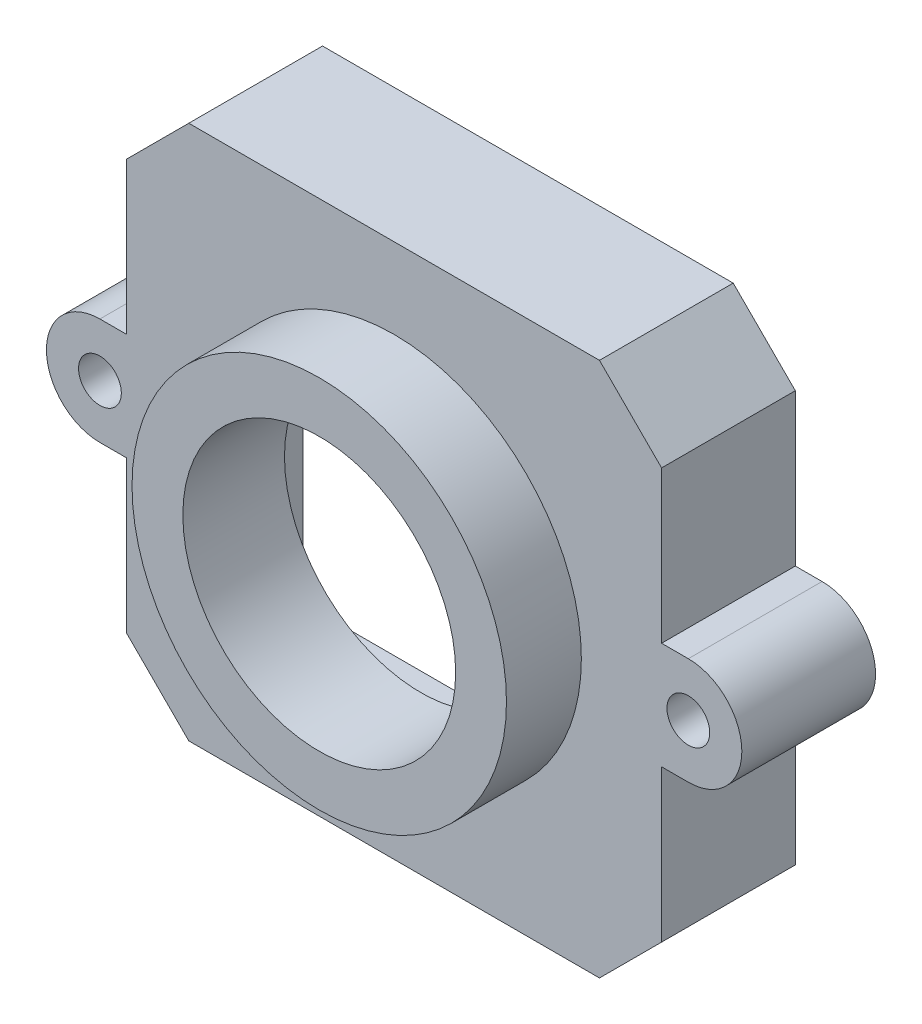
ISO-10303-21;
HEADER;
FILE_DESCRIPTION(('STEP AP214'),'2;1');
FILE_NAME('part.step','',(''),(''),'','','');
FILE_SCHEMA(('AUTOMOTIVE_DESIGN { 1 0 10303 214 1 1 1 1 }'));
ENDSEC;
DATA;
#1=APPLICATION_CONTEXT('core data for automotive mechanical design processes');
#2=APPLICATION_PROTOCOL_DEFINITION('international standard','automotive_design',2000,#1);
#3=PRODUCT_CONTEXT('',#1,'mechanical');
#4=PRODUCT('Part','Part','',(#3));
#5=PRODUCT_RELATED_PRODUCT_CATEGORY('part','',(#4));
#6=PRODUCT_DEFINITION_FORMATION('','',#4);
#7=PRODUCT_DEFINITION_CONTEXT('part definition',#1,'design');
#8=PRODUCT_DEFINITION('design','',#6,#7);
#9=PRODUCT_DEFINITION_SHAPE('','',#8);
#10=(LENGTH_UNIT() NAMED_UNIT(*) SI_UNIT(.MILLI.,.METRE.));
#11=(NAMED_UNIT(*) PLANE_ANGLE_UNIT() SI_UNIT($,.RADIAN.));
#12=(NAMED_UNIT(*) SI_UNIT($,.STERADIAN.) SOLID_ANGLE_UNIT());
#13=UNCERTAINTY_MEASURE_WITH_UNIT(LENGTH_MEASURE(1.E-05),#10,'distance_accuracy_value','');
#14=(GEOMETRIC_REPRESENTATION_CONTEXT(3) GLOBAL_UNCERTAINTY_ASSIGNED_CONTEXT((#13)) GLOBAL_UNIT_ASSIGNED_CONTEXT((#10,
#11,#12)) REPRESENTATION_CONTEXT('',''));
#15=CARTESIAN_POINT('',(0.,0.,0.));
#16=DIRECTION('',(0.,0.,1.));
#17=DIRECTION('',(1.,0.,0.));
#18=AXIS2_PLACEMENT_3D('',#15,#16,#17);
#19=CARTESIAN_POINT('',(0.,0.,1.));
#20=DIRECTION('',(0.,0.,1.));
#21=DIRECTION('',(1.,0.,0.));
#22=AXIS2_PLACEMENT_3D('',#19,#20,#21);
#23=PLANE('',#22);
#24=CARTESIAN_POINT('',(11.,0.,1.));
#25=DIRECTION('',(0.,0.,1.));
#26=DIRECTION('',(1.,0.,0.));
#27=AXIS2_PLACEMENT_3D('',#24,#25,#26);
#28=CIRCLE('',#27,0.800000000000001);
#29=CARTESIAN_POINT('',(11.8,0.,1.));
#30=VERTEX_POINT('',#29);
#31=EDGE_CURVE('E357',#30,#30,#28,.T.);
#32=ORIENTED_EDGE('',*,*,#31,.F.);
#33=EDGE_LOOP('',(#32));
#34=FACE_BOUND('',#33,.T.);
#35=CARTESIAN_POINT('',(-11.0000002241671,0.,1.));
#36=DIRECTION('',(0.,0.,1.));
#37=DIRECTION('',(1.,0.,0.));
#38=AXIS2_PLACEMENT_3D('',#35,#36,#37);
#39=CIRCLE('',#38,0.800000000000001);
#40=CARTESIAN_POINT('',(-10.2000002241671,0.,1.));
#41=VERTEX_POINT('',#40);
#42=EDGE_CURVE('E354',#41,#41,#39,.T.);
#43=ORIENTED_EDGE('',*,*,#42,.F.);
#44=EDGE_LOOP('',(#43));
#45=FACE_BOUND('',#44,.T.);
#46=DIRECTION('',(1.,0.,0.));
#47=VECTOR('',#46,1.);
#48=CARTESIAN_POINT('',(0.,-10.,1.));
#49=LINE('',#48,#47);
#50=CARTESIAN_POINT('',(-7.67766952966369,-10.,1.));
#51=VERTEX_POINT('',#50);
#52=CARTESIAN_POINT('',(7.67766952966369,-10.,1.));
#53=VERTEX_POINT('',#52);
#54=EDGE_CURVE('E299',#51,#53,#49,.T.);
#55=ORIENTED_EDGE('',*,*,#54,.T.);
#56=DIRECTION('',(0.707106781186548,0.707106781186548,0.));
#57=VECTOR('',#56,1.);
#58=CARTESIAN_POINT('',(8.83883476483185,-8.83883476483185,1.));
#59=LINE('',#58,#57);
#60=CARTESIAN_POINT('',(10.,-7.67766952966369,1.));
#61=VERTEX_POINT('',#60);
#62=EDGE_CURVE('E318',#53,#61,#59,.T.);
#63=ORIENTED_EDGE('',*,*,#62,.T.);
#64=DIRECTION('',(0.,-1.,0.));
#65=VECTOR('',#64,1.);
#66=CARTESIAN_POINT('',(10.,0.,1.));
#67=LINE('',#66,#65);
#68=CARTESIAN_POINT('',(10.,-2.,1.));
#69=VERTEX_POINT('',#68);
#70=EDGE_CURVE('E320',#69,#61,#67,.T.);
#71=ORIENTED_EDGE('',*,*,#70,.F.);
#72=DIRECTION('',(1.,0.,0.));
#73=VECTOR('',#72,1.);
#74=CARTESIAN_POINT('',(0.,-2.00000000000001,1.));
#75=LINE('',#74,#73);
#76=CARTESIAN_POINT('',(11.,-2.,1.));
#77=VERTEX_POINT('',#76);
#78=EDGE_CURVE('E323',#69,#77,#75,.T.);
#79=ORIENTED_EDGE('',*,*,#78,.T.);
#80=CARTESIAN_POINT('',(11.,0.,1.));
#81=DIRECTION('',(0.,0.,1.));
#82=DIRECTION('',(1.,0.,0.));
#83=AXIS2_PLACEMENT_3D('',#80,#81,#82);
#84=CIRCLE('',#83,2.);
#85=CARTESIAN_POINT('',(11.,2.,1.));
#86=VERTEX_POINT('',#85);
#87=EDGE_CURVE('E326',#86,#77,#84,.F.);
#88=ORIENTED_EDGE('',*,*,#87,.F.);
#89=DIRECTION('',(1.,0.,0.));
#90=VECTOR('',#89,1.);
#91=CARTESIAN_POINT('',(0.,1.99999999999999,1.));
#92=LINE('',#91,#90);
#93=CARTESIAN_POINT('',(10.,2.,1.));
#94=VERTEX_POINT('',#93);
#95=EDGE_CURVE('E329',#94,#86,#92,.T.);
#96=ORIENTED_EDGE('',*,*,#95,.F.);
#97=CARTESIAN_POINT('',(10.,7.67766952966368,1.));
#98=VERTEX_POINT('',#97);
#99=EDGE_CURVE('E324',#98,#94,#67,.T.);
#100=ORIENTED_EDGE('',*,*,#99,.F.);
#101=DIRECTION('',(0.707106781186548,-0.707106781186548,0.));
#102=VECTOR('',#101,1.);
#103=CARTESIAN_POINT('',(8.83883476483184,8.83883476483184,1.));
#104=LINE('',#103,#102);
#105=CARTESIAN_POINT('',(7.67766952966368,10.,1.));
#106=VERTEX_POINT('',#105);
#107=EDGE_CURVE('E332',#106,#98,#104,.T.);
#108=ORIENTED_EDGE('',*,*,#107,.F.);
#109=DIRECTION('',(1.,0.,0.));
#110=VECTOR('',#109,1.);
#111=CARTESIAN_POINT('',(0.,10.,1.));
#112=LINE('',#111,#110);
#113=CARTESIAN_POINT('',(-7.67766952966369,9.99999999999999,1.));
#114=VERTEX_POINT('',#113);
#115=EDGE_CURVE('E335',#114,#106,#112,.T.);
#116=ORIENTED_EDGE('',*,*,#115,.F.);
#117=DIRECTION('',(0.707106781186548,0.707106781186548,0.));
#118=VECTOR('',#117,1.);
#119=CARTESIAN_POINT('',(-8.83883476483184,8.83883476483184,1.));
#120=LINE('',#119,#118);
#121=CARTESIAN_POINT('',(-10.,7.67766952966369,1.));
#122=VERTEX_POINT('',#121);
#123=EDGE_CURVE('E338',#122,#114,#120,.T.);
#124=ORIENTED_EDGE('',*,*,#123,.F.);
#125=DIRECTION('',(0.,-1.,0.));
#126=VECTOR('',#125,1.);
#127=CARTESIAN_POINT('',(-10.,0.,1.));
#128=LINE('',#127,#126);
#129=CARTESIAN_POINT('',(-10.,2.,1.));
#130=VERTEX_POINT('',#129);
#131=EDGE_CURVE('E341',#122,#130,#128,.T.);
#132=ORIENTED_EDGE('',*,*,#131,.T.);
#133=DIRECTION('',(-1.,0.,0.));
#134=VECTOR('',#133,1.);
#135=CARTESIAN_POINT('',(0.,2.,1.));
#136=LINE('',#135,#134);
#137=CARTESIAN_POINT('',(-11.0000002241671,2.,1.));
#138=VERTEX_POINT('',#137);
#139=EDGE_CURVE('E343',#130,#138,#136,.T.);
#140=ORIENTED_EDGE('',*,*,#139,.T.);
#141=CARTESIAN_POINT('',(-11.0000002241671,0.,1.));
#142=DIRECTION('',(0.,0.,1.));
#143=DIRECTION('',(1.,0.,0.));
#144=AXIS2_PLACEMENT_3D('',#141,#142,#143);
#145=CIRCLE('',#144,2.);
#146=CARTESIAN_POINT('',(-11.0000002241671,-2.,1.));
#147=VERTEX_POINT('',#146);
#148=EDGE_CURVE('E346',#147,#138,#145,.F.);
#149=ORIENTED_EDGE('',*,*,#148,.F.);
#150=DIRECTION('',(-1.,0.,0.));
#151=VECTOR('',#150,1.);
#152=CARTESIAN_POINT('',(0.,-2.,1.));
#153=LINE('',#152,#151);
#154=CARTESIAN_POINT('',(-10.,-2.,1.));
#155=VERTEX_POINT('',#154);
#156=EDGE_CURVE('E349',#155,#147,#153,.T.);
#157=ORIENTED_EDGE('',*,*,#156,.F.);
#158=CARTESIAN_POINT('',(-10.,-7.67766952966369,1.));
#159=VERTEX_POINT('',#158);
#160=EDGE_CURVE('E344',#155,#159,#128,.T.);
#161=ORIENTED_EDGE('',*,*,#160,.T.);
#162=DIRECTION('',(0.707106781186547,-0.707106781186548,0.));
#163=VECTOR('',#162,1.);
#164=CARTESIAN_POINT('',(-8.83883476483185,-8.83883476483184,1.));
#165=LINE('',#164,#163);
#166=EDGE_CURVE('E352',#159,#51,#165,.T.);
#167=ORIENTED_EDGE('',*,*,#166,.T.);
#168=EDGE_LOOP('',(#55,#63,#71,#79,#88,#96,#100,#108,#116,#124,#132,#140,#149,#157,#161,#167));
#169=FACE_BOUND('',#168,.T.);
#170=CARTESIAN_POINT('',(0.,0.,1.));
#171=DIRECTION('',(0.,0.,1.));
#172=DIRECTION('',(1.,0.,0.));
#173=AXIS2_PLACEMENT_3D('',#170,#171,#172);
#174=CIRCLE('',#173,7.);
#175=CARTESIAN_POINT('',(7.,0.,1.));
#176=VERTEX_POINT('',#175);
#177=EDGE_CURVE('E219',#176,#176,#174,.T.);
#178=ORIENTED_EDGE('',*,*,#177,.F.);
#179=EDGE_LOOP('',(#178));
#180=FACE_BOUND('',#179,.T.);
#181=ADVANCED_FACE('F32',(#34,#45,#169,#180),#23,.T.);
#182=CARTESIAN_POINT('',(0.,-10.,1.));
#183=DIRECTION('',(0.,1.,0.));
#184=DIRECTION('',(0.,0.,1.));
#185=AXIS2_PLACEMENT_3D('',#182,#183,#184);
#186=PLANE('',#185);
#187=DIRECTION('',(0.,0.,-1.));
#188=VECTOR('',#187,1.);
#189=CARTESIAN_POINT('',(-7.67766952966369,-10.,1.));
#190=LINE('',#189,#188);
#191=CARTESIAN_POINT('',(-7.67766952966369,-10.,-4.));
#192=VERTEX_POINT('',#191);
#193=EDGE_CURVE('E360',#51,#192,#190,.T.);
#194=ORIENTED_EDGE('',*,*,#193,.T.);
#195=DIRECTION('',(1.,0.,0.));
#196=VECTOR('',#195,1.);
#197=CARTESIAN_POINT('',(0.,-10.,-4.));
#198=LINE('',#197,#196);
#199=CARTESIAN_POINT('',(7.67766952966369,-10.,-4.));
#200=VERTEX_POINT('',#199);
#201=EDGE_CURVE('E233',#192,#200,#198,.T.);
#202=ORIENTED_EDGE('',*,*,#201,.T.);
#203=DIRECTION('',(0.,0.,-1.));
#204=VECTOR('',#203,1.);
#205=CARTESIAN_POINT('',(7.67766952966369,-10.,1.));
#206=LINE('',#205,#204);
#207=EDGE_CURVE('E11',#53,#200,#206,.T.);
#208=ORIENTED_EDGE('',*,*,#207,.F.);
#209=ORIENTED_EDGE('',*,*,#54,.F.);
#210=EDGE_LOOP('',(#194,#202,#208,#209));
#211=FACE_BOUND('',#210,.T.);
#212=ADVANCED_FACE('F34',(#211),#186,.F.);
#213=CARTESIAN_POINT('',(8.83883476483185,-8.83883476483185,1.));
#214=DIRECTION('',(-0.707106781186547,0.707106781186547,0.));
#215=DIRECTION('',(-0.707106781186548,-0.707106781186548,0.));
#216=AXIS2_PLACEMENT_3D('',#213,#214,#215);
#217=PLANE('',#216);
#218=ORIENTED_EDGE('',*,*,#207,.T.);
#219=DIRECTION('',(0.707106781186548,0.707106781186548,0.));
#220=VECTOR('',#219,1.);
#221=CARTESIAN_POINT('',(8.83883476483185,-8.83883476483185,-4.));
#222=LINE('',#221,#220);
#223=CARTESIAN_POINT('',(10.,-7.67766952966369,-4.));
#224=VERTEX_POINT('',#223);
#225=EDGE_CURVE('E236',#200,#224,#222,.T.);
#226=ORIENTED_EDGE('',*,*,#225,.T.);
#227=DIRECTION('',(0.,0.,-1.));
#228=VECTOR('',#227,1.);
#229=CARTESIAN_POINT('',(10.,-7.67766952966369,1.));
#230=LINE('',#229,#228);
#231=EDGE_CURVE('E41',#61,#224,#230,.T.);
#232=ORIENTED_EDGE('',*,*,#231,.F.);
#233=ORIENTED_EDGE('',*,*,#62,.F.);
#234=EDGE_LOOP('',(#218,#226,#232,#233));
#235=FACE_BOUND('',#234,.T.);
#236=ADVANCED_FACE('F398',(#235),#217,.F.);
#237=CARTESIAN_POINT('',(10.,0.,1.));
#238=DIRECTION('',(1.,0.,0.));
#239=DIRECTION('',(0.,0.,-1.));
#240=AXIS2_PLACEMENT_3D('',#237,#238,#239);
#241=PLANE('',#240);
#242=ORIENTED_EDGE('',*,*,#231,.T.);
#243=DIRECTION('',(0.,-1.,0.));
#244=VECTOR('',#243,1.);
#245=CARTESIAN_POINT('',(10.,0.,-4.));
#246=LINE('',#245,#244);
#247=CARTESIAN_POINT('',(10.,-2.,-4.));
#248=VERTEX_POINT('',#247);
#249=EDGE_CURVE('E239',#248,#224,#246,.T.);
#250=ORIENTED_EDGE('',*,*,#249,.F.);
#251=DIRECTION('',(0.,0.,-1.));
#252=VECTOR('',#251,1.);
#253=CARTESIAN_POINT('',(10.,-2.,1.));
#254=LINE('',#253,#252);
#255=EDGE_CURVE('E386',#69,#248,#254,.T.);
#256=ORIENTED_EDGE('',*,*,#255,.F.);
#257=ORIENTED_EDGE('',*,*,#70,.T.);
#258=EDGE_LOOP('',(#242,#250,#256,#257));
#259=FACE_BOUND('',#258,.T.);
#260=ADVANCED_FACE('F391',(#259),#241,.T.);
#261=CARTESIAN_POINT('',(0.,-2.00000000000001,1.));
#262=DIRECTION('',(0.,1.,0.));
#263=DIRECTION('',(-1.,0.,0.));
#264=AXIS2_PLACEMENT_3D('',#261,#262,#263);
#265=PLANE('',#264);
#266=ORIENTED_EDGE('',*,*,#255,.T.);
#267=DIRECTION('',(1.,0.,0.));
#268=VECTOR('',#267,1.);
#269=CARTESIAN_POINT('',(0.,-2.00000000000001,-4.));
#270=LINE('',#269,#268);
#271=CARTESIAN_POINT('',(11.,-2.,-4.));
#272=VERTEX_POINT('',#271);
#273=EDGE_CURVE('E242',#248,#272,#270,.T.);
#274=ORIENTED_EDGE('',*,*,#273,.T.);
#275=DIRECTION('',(0.,0.,-1.));
#276=VECTOR('',#275,1.);
#277=CARTESIAN_POINT('',(11.,-2.,1.));
#278=LINE('',#277,#276);
#279=EDGE_CURVE('E384',#77,#272,#278,.T.);
#280=ORIENTED_EDGE('',*,*,#279,.F.);
#281=ORIENTED_EDGE('',*,*,#78,.F.);
#282=EDGE_LOOP('',(#266,#274,#280,#281));
#283=FACE_BOUND('',#282,.T.);
#284=ADVANCED_FACE('F460',(#283),#265,.F.);
#285=CARTESIAN_POINT('',(11.,0.,1.));
#286=DIRECTION('',(0.,0.,-1.));
#287=DIRECTION('',(-1.,0.,0.));
#288=AXIS2_PLACEMENT_3D('',#285,#286,#287);
#289=CYLINDRICAL_SURFACE('',#288,2.);
#290=ORIENTED_EDGE('',*,*,#279,.T.);
#291=CARTESIAN_POINT('',(11.,0.,-4.));
#292=DIRECTION('',(0.,0.,1.));
#293=DIRECTION('',(1.,0.,0.));
#294=AXIS2_PLACEMENT_3D('',#291,#292,#293);
#295=CIRCLE('',#294,2.);
#296=CARTESIAN_POINT('',(11.,2.,-4.));
#297=VERTEX_POINT('',#296);
#298=EDGE_CURVE('E246',#297,#272,#295,.F.);
#299=ORIENTED_EDGE('',*,*,#298,.F.);
#300=DIRECTION('',(0.,0.,-1.));
#301=VECTOR('',#300,1.);
#302=CARTESIAN_POINT('',(11.,2.,1.));
#303=LINE('',#302,#301);
#304=EDGE_CURVE('E382',#86,#297,#303,.T.);
#305=ORIENTED_EDGE('',*,*,#304,.F.);
#306=ORIENTED_EDGE('',*,*,#87,.T.);
#307=EDGE_LOOP('',(#290,#299,#305,#306));
#308=FACE_BOUND('',#307,.T.);
#309=ADVANCED_FACE('F456',(#308),#289,.T.);
#310=CARTESIAN_POINT('',(0.,1.99999999999999,1.));
#311=DIRECTION('',(0.,1.,0.));
#312=DIRECTION('',(-1.,0.,0.));
#313=AXIS2_PLACEMENT_3D('',#310,#311,#312);
#314=PLANE('',#313);
#315=ORIENTED_EDGE('',*,*,#304,.T.);
#316=DIRECTION('',(1.,0.,0.));
#317=VECTOR('',#316,1.);
#318=CARTESIAN_POINT('',(0.,1.99999999999999,-4.));
#319=LINE('',#318,#317);
#320=CARTESIAN_POINT('',(10.,2.,-4.));
#321=VERTEX_POINT('',#320);
#322=EDGE_CURVE('E249',#321,#297,#319,.T.);
#323=ORIENTED_EDGE('',*,*,#322,.F.);
#324=DIRECTION('',(0.,0.,-1.));
#325=VECTOR('',#324,1.);
#326=CARTESIAN_POINT('',(10.,2.,1.));
#327=LINE('',#326,#325);
#328=EDGE_CURVE('E380',#94,#321,#327,.T.);
#329=ORIENTED_EDGE('',*,*,#328,.F.);
#330=ORIENTED_EDGE('',*,*,#95,.T.);
#331=EDGE_LOOP('',(#315,#323,#329,#330));
#332=FACE_BOUND('',#331,.T.);
#333=ADVANCED_FACE('F452',(#332),#314,.T.);
#334=ORIENTED_EDGE('',*,*,#328,.T.);
#335=CARTESIAN_POINT('',(10.,7.67766952966368,-4.));
#336=VERTEX_POINT('',#335);
#337=EDGE_CURVE('E243',#336,#321,#246,.T.);
#338=ORIENTED_EDGE('',*,*,#337,.F.);
#339=DIRECTION('',(0.,0.,-1.));
#340=VECTOR('',#339,1.);
#341=CARTESIAN_POINT('',(10.,7.67766952966368,1.));
#342=LINE('',#341,#340);
#343=EDGE_CURVE('E378',#98,#336,#342,.T.);
#344=ORIENTED_EDGE('',*,*,#343,.F.);
#345=ORIENTED_EDGE('',*,*,#99,.T.);
#346=EDGE_LOOP('',(#334,#338,#344,#345));
#347=FACE_BOUND('',#346,.T.);
#348=ADVANCED_FACE('F448',(#347),#241,.T.);
#349=CARTESIAN_POINT('',(8.83883476483184,8.83883476483184,1.));
#350=DIRECTION('',(0.707106781186547,0.707106781186547,0.));
#351=DIRECTION('',(-0.707106781186548,0.707106781186548,0.));
#352=AXIS2_PLACEMENT_3D('',#349,#350,#351);
#353=PLANE('',#352);
#354=ORIENTED_EDGE('',*,*,#343,.T.);
#355=DIRECTION('',(0.707106781186548,-0.707106781186548,0.));
#356=VECTOR('',#355,1.);
#357=CARTESIAN_POINT('',(8.83883476483184,8.83883476483184,-4.));
#358=LINE('',#357,#356);
#359=CARTESIAN_POINT('',(7.67766952966368,10.,-4.));
#360=VERTEX_POINT('',#359);
#361=EDGE_CURVE('E252',#360,#336,#358,.T.);
#362=ORIENTED_EDGE('',*,*,#361,.F.);
#363=DIRECTION('',(0.,0.,-1.));
#364=VECTOR('',#363,1.);
#365=CARTESIAN_POINT('',(7.67766952966368,10.,1.));
#366=LINE('',#365,#364);
#367=EDGE_CURVE('E376',#106,#360,#366,.T.);
#368=ORIENTED_EDGE('',*,*,#367,.F.);
#369=ORIENTED_EDGE('',*,*,#107,.T.);
#370=EDGE_LOOP('',(#354,#362,#368,#369));
#371=FACE_BOUND('',#370,.T.);
#372=ADVANCED_FACE('F443',(#371),#353,.T.);
#373=CARTESIAN_POINT('',(0.,10.,1.));
#374=DIRECTION('',(0.,1.,0.));
#375=DIRECTION('',(0.,0.,1.));
#376=AXIS2_PLACEMENT_3D('',#373,#374,#375);
#377=PLANE('',#376);
#378=ORIENTED_EDGE('',*,*,#367,.T.);
#379=DIRECTION('',(1.,0.,0.));
#380=VECTOR('',#379,1.);
#381=CARTESIAN_POINT('',(0.,10.,-4.));
#382=LINE('',#381,#380);
#383=CARTESIAN_POINT('',(-7.67766952966369,9.99999999999999,-4.));
#384=VERTEX_POINT('',#383);
#385=EDGE_CURVE('E255',#384,#360,#382,.T.);
#386=ORIENTED_EDGE('',*,*,#385,.F.);
#387=DIRECTION('',(0.,0.,-1.));
#388=VECTOR('',#387,1.);
#389=CARTESIAN_POINT('',(-7.67766952966369,9.99999999999999,1.));
#390=LINE('',#389,#388);
#391=EDGE_CURVE('E374',#114,#384,#390,.T.);
#392=ORIENTED_EDGE('',*,*,#391,.F.);
#393=ORIENTED_EDGE('',*,*,#115,.T.);
#394=EDGE_LOOP('',(#378,#386,#392,#393));
#395=FACE_BOUND('',#394,.T.);
#396=ADVANCED_FACE('F439',(#395),#377,.T.);
#397=CARTESIAN_POINT('',(-8.83883476483184,8.83883476483184,1.));
#398=DIRECTION('',(-0.707106781186547,0.707106781186547,0.));
#399=DIRECTION('',(-0.707106781186548,-0.707106781186548,0.));
#400=AXIS2_PLACEMENT_3D('',#397,#398,#399);
#401=PLANE('',#400);
#402=ORIENTED_EDGE('',*,*,#391,.T.);
#403=DIRECTION('',(0.707106781186548,0.707106781186548,0.));
#404=VECTOR('',#403,1.);
#405=CARTESIAN_POINT('',(-8.83883476483184,8.83883476483184,-4.));
#406=LINE('',#405,#404);
#407=CARTESIAN_POINT('',(-10.,7.67766952966369,-4.));
#408=VERTEX_POINT('',#407);
#409=EDGE_CURVE('E258',#408,#384,#406,.T.);
#410=ORIENTED_EDGE('',*,*,#409,.F.);
#411=DIRECTION('',(0.,0.,-1.));
#412=VECTOR('',#411,1.);
#413=CARTESIAN_POINT('',(-10.,7.67766952966369,1.));
#414=LINE('',#413,#412);
#415=EDGE_CURVE('E372',#122,#408,#414,.T.);
#416=ORIENTED_EDGE('',*,*,#415,.F.);
#417=ORIENTED_EDGE('',*,*,#123,.T.);
#418=EDGE_LOOP('',(#402,#410,#416,#417));
#419=FACE_BOUND('',#418,.T.);
#420=ADVANCED_FACE('F434',(#419),#401,.T.);
#421=CARTESIAN_POINT('',(-10.,0.,1.));
#422=DIRECTION('',(1.,0.,0.));
#423=DIRECTION('',(0.,0.,-1.));
#424=AXIS2_PLACEMENT_3D('',#421,#422,#423);
#425=PLANE('',#424);
#426=ORIENTED_EDGE('',*,*,#415,.T.);
#427=DIRECTION('',(0.,-1.,0.));
#428=VECTOR('',#427,1.);
#429=CARTESIAN_POINT('',(-10.,0.,-4.));
#430=LINE('',#429,#428);
#431=CARTESIAN_POINT('',(-10.,2.,-4.));
#432=VERTEX_POINT('',#431);
#433=EDGE_CURVE('E261',#408,#432,#430,.T.);
#434=ORIENTED_EDGE('',*,*,#433,.T.);
#435=DIRECTION('',(0.,0.,-1.));
#436=VECTOR('',#435,1.);
#437=CARTESIAN_POINT('',(-10.,2.,1.));
#438=LINE('',#437,#436);
#439=EDGE_CURVE('E370',#130,#432,#438,.T.);
#440=ORIENTED_EDGE('',*,*,#439,.F.);
#441=ORIENTED_EDGE('',*,*,#131,.F.);
#442=EDGE_LOOP('',(#426,#434,#440,#441));
#443=FACE_BOUND('',#442,.T.);
#444=ADVANCED_FACE('F429',(#443),#425,.F.);
#445=CARTESIAN_POINT('',(0.,2.,1.));
#446=DIRECTION('',(0.,-1.,0.));
#447=DIRECTION('',(0.,0.,-1.));
#448=AXIS2_PLACEMENT_3D('',#445,#446,#447);
#449=PLANE('',#448);
#450=ORIENTED_EDGE('',*,*,#439,.T.);
#451=DIRECTION('',(-1.,0.,0.));
#452=VECTOR('',#451,1.);
#453=CARTESIAN_POINT('',(0.,2.,-4.));
#454=LINE('',#453,#452);
#455=CARTESIAN_POINT('',(-11.0000002241671,2.,-4.));
#456=VERTEX_POINT('',#455);
#457=EDGE_CURVE('E264',#432,#456,#454,.T.);
#458=ORIENTED_EDGE('',*,*,#457,.T.);
#459=DIRECTION('',(0.,0.,-1.));
#460=VECTOR('',#459,1.);
#461=CARTESIAN_POINT('',(-11.0000002241671,2.,1.));
#462=LINE('',#461,#460);
#463=EDGE_CURVE('E368',#138,#456,#462,.T.);
#464=ORIENTED_EDGE('',*,*,#463,.F.);
#465=ORIENTED_EDGE('',*,*,#139,.F.);
#466=EDGE_LOOP('',(#450,#458,#464,#465));
#467=FACE_BOUND('',#466,.T.);
#468=ADVANCED_FACE('F425',(#467),#449,.F.);
#469=CARTESIAN_POINT('',(-11.0000002241671,0.,1.));
#470=DIRECTION('',(0.,0.,-1.));
#471=DIRECTION('',(-1.,0.,0.));
#472=AXIS2_PLACEMENT_3D('',#469,#470,#471);
#473=CYLINDRICAL_SURFACE('',#472,2.);
#474=ORIENTED_EDGE('',*,*,#463,.T.);
#475=CARTESIAN_POINT('',(-11.0000002241671,0.,-4.));
#476=DIRECTION('',(0.,0.,1.));
#477=DIRECTION('',(1.,0.,0.));
#478=AXIS2_PLACEMENT_3D('',#475,#476,#477);
#479=CIRCLE('',#478,2.);
#480=CARTESIAN_POINT('',(-11.0000002241671,-2.,-4.));
#481=VERTEX_POINT('',#480);
#482=EDGE_CURVE('E268',#481,#456,#479,.F.);
#483=ORIENTED_EDGE('',*,*,#482,.F.);
#484=DIRECTION('',(0.,0.,-1.));
#485=VECTOR('',#484,1.);
#486=CARTESIAN_POINT('',(-11.0000002241671,-2.,1.));
#487=LINE('',#486,#485);
#488=EDGE_CURVE('E366',#147,#481,#487,.T.);
#489=ORIENTED_EDGE('',*,*,#488,.F.);
#490=ORIENTED_EDGE('',*,*,#148,.T.);
#491=EDGE_LOOP('',(#474,#483,#489,#490));
#492=FACE_BOUND('',#491,.T.);
#493=ADVANCED_FACE('F421',(#492),#473,.T.);
#494=CARTESIAN_POINT('',(0.,-2.,1.));
#495=DIRECTION('',(0.,-1.,0.));
#496=DIRECTION('',(0.,0.,-1.));
#497=AXIS2_PLACEMENT_3D('',#494,#495,#496);
#498=PLANE('',#497);
#499=ORIENTED_EDGE('',*,*,#488,.T.);
#500=DIRECTION('',(-1.,0.,0.));
#501=VECTOR('',#500,1.);
#502=CARTESIAN_POINT('',(0.,-2.,-4.));
#503=LINE('',#502,#501);
#504=CARTESIAN_POINT('',(-10.,-2.,-4.));
#505=VERTEX_POINT('',#504);
#506=EDGE_CURVE('E271',#505,#481,#503,.T.);
#507=ORIENTED_EDGE('',*,*,#506,.F.);
#508=DIRECTION('',(0.,0.,-1.));
#509=VECTOR('',#508,1.);
#510=CARTESIAN_POINT('',(-10.,-2.,1.));
#511=LINE('',#510,#509);
#512=EDGE_CURVE('E364',#155,#505,#511,.T.);
#513=ORIENTED_EDGE('',*,*,#512,.F.);
#514=ORIENTED_EDGE('',*,*,#156,.T.);
#515=EDGE_LOOP('',(#499,#507,#513,#514));
#516=FACE_BOUND('',#515,.T.);
#517=ADVANCED_FACE('F417',(#516),#498,.T.);
#518=ORIENTED_EDGE('',*,*,#512,.T.);
#519=CARTESIAN_POINT('',(-10.,-7.67766952966369,-4.));
#520=VERTEX_POINT('',#519);
#521=EDGE_CURVE('E265',#505,#520,#430,.T.);
#522=ORIENTED_EDGE('',*,*,#521,.T.);
#523=DIRECTION('',(0.,0.,-1.));
#524=VECTOR('',#523,1.);
#525=CARTESIAN_POINT('',(-10.,-7.67766952966369,1.));
#526=LINE('',#525,#524);
#527=EDGE_CURVE('E362',#159,#520,#526,.T.);
#528=ORIENTED_EDGE('',*,*,#527,.F.);
#529=ORIENTED_EDGE('',*,*,#160,.F.);
#530=EDGE_LOOP('',(#518,#522,#528,#529));
#531=FACE_BOUND('',#530,.T.);
#532=ADVANCED_FACE('F412',(#531),#425,.F.);
#533=CARTESIAN_POINT('',(-11.0000002241671,0.,1.));
#534=DIRECTION('',(0.,0.,-1.));
#535=DIRECTION('',(-1.,0.,0.));
#536=AXIS2_PLACEMENT_3D('',#533,#534,#535);
#537=CYLINDRICAL_SURFACE('',#536,0.800000000000001);
#538=ORIENTED_EDGE('',*,*,#42,.T.);
#539=EDGE_LOOP('',(#538));
#540=FACE_BOUND('',#539,.T.);
#541=CARTESIAN_POINT('',(-11.0000002241671,0.,-4.));
#542=DIRECTION('',(0.,0.,1.));
#543=DIRECTION('',(1.,0.,0.));
#544=AXIS2_PLACEMENT_3D('',#541,#542,#543);
#545=CIRCLE('',#544,0.800000000000001);
#546=CARTESIAN_POINT('',(-10.2000002241671,0.,-4.));
#547=VERTEX_POINT('',#546);
#548=EDGE_CURVE('E277',#547,#547,#545,.T.);
#549=ORIENTED_EDGE('',*,*,#548,.F.);
#550=EDGE_LOOP('',(#549));
#551=FACE_BOUND('',#550,.T.);
#552=ADVANCED_FACE('F530',(#540,#551),#537,.F.);
#553=CARTESIAN_POINT('',(-8.83883476483185,-8.83883476483184,1.));
#554=DIRECTION('',(0.707106781186548,0.707106781186547,0.));
#555=DIRECTION('',(-0.707106781186547,0.707106781186548,0.));
#556=AXIS2_PLACEMENT_3D('',#553,#554,#555);
#557=PLANE('',#556);
#558=ORIENTED_EDGE('',*,*,#527,.T.);
#559=DIRECTION('',(0.707106781186547,-0.707106781186548,0.));
#560=VECTOR('',#559,1.);
#561=CARTESIAN_POINT('',(-8.83883476483185,-8.83883476483184,-4.));
#562=LINE('',#561,#560);
#563=EDGE_CURVE('E274',#520,#192,#562,.T.);
#564=ORIENTED_EDGE('',*,*,#563,.T.);
#565=ORIENTED_EDGE('',*,*,#193,.F.);
#566=ORIENTED_EDGE('',*,*,#166,.F.);
#567=EDGE_LOOP('',(#558,#564,#565,#566));
#568=FACE_BOUND('',#567,.T.);
#569=ADVANCED_FACE('F406',(#568),#557,.F.);
#570=CARTESIAN_POINT('',(11.,0.,1.));
#571=DIRECTION('',(0.,0.,-1.));
#572=DIRECTION('',(-1.,0.,0.));
#573=AXIS2_PLACEMENT_3D('',#570,#571,#572);
#574=CYLINDRICAL_SURFACE('',#573,0.800000000000001);
#575=ORIENTED_EDGE('',*,*,#31,.T.);
#576=EDGE_LOOP('',(#575));
#577=FACE_BOUND('',#576,.T.);
#578=CARTESIAN_POINT('',(11.,0.,-4.));
#579=DIRECTION('',(0.,0.,1.));
#580=DIRECTION('',(1.,0.,0.));
#581=AXIS2_PLACEMENT_3D('',#578,#579,#580);
#582=CIRCLE('',#581,0.800000000000001);
#583=CARTESIAN_POINT('',(11.8,0.,-4.));
#584=VERTEX_POINT('',#583);
#585=EDGE_CURVE('E212',#584,#584,#582,.T.);
#586=ORIENTED_EDGE('',*,*,#585,.F.);
#587=EDGE_LOOP('',(#586));
#588=FACE_BOUND('',#587,.T.);
#589=ADVANCED_FACE('F522',(#577,#588),#574,.F.);
#590=CARTESIAN_POINT('',(-7.70746391493337,7.70746391493336,-4.));
#591=DIRECTION('',(-0.707106781186548,0.707106781186547,0.));
#592=DIRECTION('',(-0.707106781186547,-0.707106781186548,0.));
#593=AXIS2_PLACEMENT_3D('',#590,#591,#592);
#594=PLANE('',#593);
#595=DIRECTION('',(-0.707106781186547,-0.707106781186548,0.));
#596=VECTOR('',#595,1.);
#597=CARTESIAN_POINT('',(-7.70746391493337,7.70746391493336,0.));
#598=LINE('',#597,#596);
#599=CARTESIAN_POINT('',(-7.01492782986674,8.4,0.));
#600=VERTEX_POINT('',#599);
#601=CARTESIAN_POINT('',(-8.4,7.01492782986674,0.));
#602=VERTEX_POINT('',#601);
#603=EDGE_CURVE('E282',#600,#602,#598,.T.);
#604=ORIENTED_EDGE('',*,*,#603,.T.);
#605=DIRECTION('',(0.,0.,1.));
#606=VECTOR('',#605,1.);
#607=CARTESIAN_POINT('',(-8.4,7.01492782986674,-4.));
#608=LINE('',#607,#606);
#609=CARTESIAN_POINT('',(-8.4,7.01492782986674,-4.));
#610=VERTEX_POINT('',#609);
#611=EDGE_CURVE('E215',#610,#602,#608,.T.);
#612=ORIENTED_EDGE('',*,*,#611,.F.);
#613=DIRECTION('',(-0.707106781186547,-0.707106781186548,0.));
#614=VECTOR('',#613,1.);
#615=CARTESIAN_POINT('',(-7.70746391493337,7.70746391493336,-4.));
#616=LINE('',#615,#614);
#617=CARTESIAN_POINT('',(-7.01492782986674,8.4,-4.));
#618=VERTEX_POINT('',#617);
#619=EDGE_CURVE('E196',#618,#610,#616,.T.);
#620=ORIENTED_EDGE('',*,*,#619,.F.);
#621=DIRECTION('',(0.,0.,1.));
#622=VECTOR('',#621,1.);
#623=CARTESIAN_POINT('',(-7.01492782986674,8.4,-4.));
#624=LINE('',#623,#622);
#625=EDGE_CURVE('E206',#618,#600,#624,.T.);
#626=ORIENTED_EDGE('',*,*,#625,.T.);
#627=EDGE_LOOP('',(#604,#612,#620,#626));
#628=FACE_BOUND('',#627,.T.);
#629=ADVANCED_FACE('F214',(#628),#594,.F.);
#630=CARTESIAN_POINT('',(-8.4,0.,-4.));
#631=DIRECTION('',(-1.,0.,0.));
#632=DIRECTION('',(0.,-1.,0.));
#633=AXIS2_PLACEMENT_3D('',#630,#631,#632);
#634=PLANE('',#633);
#635=DIRECTION('',(0.,-1.,0.));
#636=VECTOR('',#635,1.);
#637=CARTESIAN_POINT('',(-8.4,0.,0.));
#638=LINE('',#637,#636);
#639=CARTESIAN_POINT('',(-8.4,-7.01492782986675,0.));
#640=VERTEX_POINT('',#639);
#641=EDGE_CURVE('E48',#602,#640,#638,.T.);
#642=ORIENTED_EDGE('',*,*,#641,.T.);
#643=DIRECTION('',(0.,0.,1.));
#644=VECTOR('',#643,1.);
#645=CARTESIAN_POINT('',(-8.4,-7.01492782986675,-4.));
#646=LINE('',#645,#644);
#647=CARTESIAN_POINT('',(-8.4,-7.01492782986675,-4.));
#648=VERTEX_POINT('',#647);
#649=EDGE_CURVE('E300',#648,#640,#646,.T.);
#650=ORIENTED_EDGE('',*,*,#649,.F.);
#651=DIRECTION('',(0.,-1.,0.));
#652=VECTOR('',#651,1.);
#653=CARTESIAN_POINT('',(-8.4,0.,-4.));
#654=LINE('',#653,#652);
#655=EDGE_CURVE('E231',#610,#648,#654,.T.);
#656=ORIENTED_EDGE('',*,*,#655,.F.);
#657=ORIENTED_EDGE('',*,*,#611,.T.);
#658=EDGE_LOOP('',(#642,#650,#656,#657));
#659=FACE_BOUND('',#658,.T.);
#660=ADVANCED_FACE('F495',(#659),#634,.F.);
#661=CARTESIAN_POINT('',(-7.70746391493337,-7.70746391493338,-4.));
#662=DIRECTION('',(-0.707106781186547,-0.707106781186548,0.));
#663=DIRECTION('',(0.707106781186548,-0.707106781186547,0.));
#664=AXIS2_PLACEMENT_3D('',#661,#662,#663);
#665=PLANE('',#664);
#666=DIRECTION('',(0.707106781186548,-0.707106781186547,0.));
#667=VECTOR('',#666,1.);
#668=CARTESIAN_POINT('',(-7.70746391493337,-7.70746391493338,0.));
#669=LINE('',#668,#667);
#670=CARTESIAN_POINT('',(-7.01492782986674,-8.4,0.));
#671=VERTEX_POINT('',#670);
#672=EDGE_CURVE('E53',#640,#671,#669,.T.);
#673=ORIENTED_EDGE('',*,*,#672,.T.);
#674=DIRECTION('',(0.,0.,1.));
#675=VECTOR('',#674,1.);
#676=CARTESIAN_POINT('',(-7.01492782986674,-8.4,-4.));
#677=LINE('',#676,#675);
#678=CARTESIAN_POINT('',(-7.01492782986674,-8.4,-4.));
#679=VERTEX_POINT('',#678);
#680=EDGE_CURVE('E303',#679,#671,#677,.T.);
#681=ORIENTED_EDGE('',*,*,#680,.F.);
#682=DIRECTION('',(0.707106781186548,-0.707106781186547,0.));
#683=VECTOR('',#682,1.);
#684=CARTESIAN_POINT('',(-7.70746391493337,-7.70746391493338,-4.));
#685=LINE('',#684,#683);
#686=EDGE_CURVE('E229',#648,#679,#685,.T.);
#687=ORIENTED_EDGE('',*,*,#686,.F.);
#688=ORIENTED_EDGE('',*,*,#649,.T.);
#689=EDGE_LOOP('',(#673,#681,#687,#688));
#690=FACE_BOUND('',#689,.T.);
#691=ADVANCED_FACE('F498',(#690),#665,.F.);
#692=CARTESIAN_POINT('',(0.,-8.4,-4.));
#693=DIRECTION('',(0.,-1.,0.));
#694=DIRECTION('',(0.,0.,-1.));
#695=AXIS2_PLACEMENT_3D('',#692,#693,#694);
#696=PLANE('',#695);
#697=DIRECTION('',(1.,0.,0.));
#698=VECTOR('',#697,1.);
#699=CARTESIAN_POINT('',(0.,-8.4,0.));
#700=LINE('',#699,#698);
#701=CARTESIAN_POINT('',(7.01492782986674,-8.4,0.));
#702=VERTEX_POINT('',#701);
#703=EDGE_CURVE('E294',#671,#702,#700,.T.);
#704=ORIENTED_EDGE('',*,*,#703,.T.);
#705=DIRECTION('',(0.,0.,1.));
#706=VECTOR('',#705,1.);
#707=CARTESIAN_POINT('',(7.01492782986674,-8.4,-4.));
#708=LINE('',#707,#706);
#709=CARTESIAN_POINT('',(7.01492782986674,-8.4,-4.));
#710=VERTEX_POINT('',#709);
#711=EDGE_CURVE('E306',#710,#702,#708,.T.);
#712=ORIENTED_EDGE('',*,*,#711,.F.);
#713=DIRECTION('',(1.,0.,0.));
#714=VECTOR('',#713,1.);
#715=CARTESIAN_POINT('',(0.,-8.4,-4.));
#716=LINE('',#715,#714);
#717=EDGE_CURVE('E227',#679,#710,#716,.T.);
#718=ORIENTED_EDGE('',*,*,#717,.F.);
#719=ORIENTED_EDGE('',*,*,#680,.T.);
#720=EDGE_LOOP('',(#704,#712,#718,#719));
#721=FACE_BOUND('',#720,.T.);
#722=ADVANCED_FACE('F502',(#721),#696,.F.);
#723=CARTESIAN_POINT('',(7.70746391493337,-7.70746391493337,-4.));
#724=DIRECTION('',(0.707106781186547,-0.707106781186547,0.));
#725=DIRECTION('',(0.707106781186548,0.707106781186548,0.));
#726=AXIS2_PLACEMENT_3D('',#723,#724,#725);
#727=PLANE('',#726);
#728=DIRECTION('',(0.707106781186548,0.707106781186548,0.));
#729=VECTOR('',#728,1.);
#730=CARTESIAN_POINT('',(7.70746391493337,-7.70746391493337,0.));
#731=LINE('',#730,#729);
#732=CARTESIAN_POINT('',(8.4,-7.01492782986674,0.));
#733=VERTEX_POINT('',#732);
#734=EDGE_CURVE('E291',#702,#733,#731,.T.);
#735=ORIENTED_EDGE('',*,*,#734,.T.);
#736=DIRECTION('',(0.,0.,1.));
#737=VECTOR('',#736,1.);
#738=CARTESIAN_POINT('',(8.4,-7.01492782986674,-4.));
#739=LINE('',#738,#737);
#740=CARTESIAN_POINT('',(8.4,-7.01492782986674,-4.));
#741=VERTEX_POINT('',#740);
#742=EDGE_CURVE('E309',#741,#733,#739,.T.);
#743=ORIENTED_EDGE('',*,*,#742,.F.);
#744=DIRECTION('',(0.707106781186548,0.707106781186548,0.));
#745=VECTOR('',#744,1.);
#746=CARTESIAN_POINT('',(7.70746391493337,-7.70746391493337,-4.));
#747=LINE('',#746,#745);
#748=EDGE_CURVE('E225',#710,#741,#747,.T.);
#749=ORIENTED_EDGE('',*,*,#748,.F.);
#750=ORIENTED_EDGE('',*,*,#711,.T.);
#751=EDGE_LOOP('',(#735,#743,#749,#750));
#752=FACE_BOUND('',#751,.T.);
#753=ADVANCED_FACE('F506',(#752),#727,.F.);
#754=CARTESIAN_POINT('',(8.4,0.,-4.));
#755=DIRECTION('',(1.,0.,0.));
#756=DIRECTION('',(0.,0.,-1.));
#757=AXIS2_PLACEMENT_3D('',#754,#755,#756);
#758=PLANE('',#757);
#759=DIRECTION('',(0.,1.,0.));
#760=VECTOR('',#759,1.);
#761=CARTESIAN_POINT('',(8.4,0.,0.));
#762=LINE('',#761,#760);
#763=CARTESIAN_POINT('',(8.4,7.01492782986674,0.));
#764=VERTEX_POINT('',#763);
#765=EDGE_CURVE('E288',#733,#764,#762,.T.);
#766=ORIENTED_EDGE('',*,*,#765,.T.);
#767=DIRECTION('',(0.,0.,1.));
#768=VECTOR('',#767,1.);
#769=CARTESIAN_POINT('',(8.4,7.01492782986673,-4.));
#770=LINE('',#769,#768);
#771=CARTESIAN_POINT('',(8.4,7.01492782986673,-4.));
#772=VERTEX_POINT('',#771);
#773=EDGE_CURVE('E312',#772,#764,#770,.T.);
#774=ORIENTED_EDGE('',*,*,#773,.F.);
#775=DIRECTION('',(0.,1.,0.));
#776=VECTOR('',#775,1.);
#777=CARTESIAN_POINT('',(8.4,0.,-4.));
#778=LINE('',#777,#776);
#779=EDGE_CURVE('E223',#741,#772,#778,.T.);
#780=ORIENTED_EDGE('',*,*,#779,.F.);
#781=ORIENTED_EDGE('',*,*,#742,.T.);
#782=EDGE_LOOP('',(#766,#774,#780,#781));
#783=FACE_BOUND('',#782,.T.);
#784=ADVANCED_FACE('F510',(#783),#758,.F.);
#785=CARTESIAN_POINT('',(7.70746391493337,7.70746391493337,-4.));
#786=DIRECTION('',(0.707106781186548,0.707106781186547,0.));
#787=DIRECTION('',(-0.707106781186547,0.707106781186548,0.));
#788=AXIS2_PLACEMENT_3D('',#785,#786,#787);
#789=PLANE('',#788);
#790=DIRECTION('',(-0.707106781186547,0.707106781186548,0.));
#791=VECTOR('',#790,1.);
#792=CARTESIAN_POINT('',(7.70746391493337,7.70746391493337,0.));
#793=LINE('',#792,#791);
#794=CARTESIAN_POINT('',(7.01492782986674,8.4,0.));
#795=VERTEX_POINT('',#794);
#796=EDGE_CURVE('E285',#764,#795,#793,.T.);
#797=ORIENTED_EDGE('',*,*,#796,.T.);
#798=DIRECTION('',(0.,0.,1.));
#799=VECTOR('',#798,1.);
#800=CARTESIAN_POINT('',(7.01492782986674,8.4,-4.));
#801=LINE('',#800,#799);
#802=CARTESIAN_POINT('',(7.01492782986674,8.4,-4.));
#803=VERTEX_POINT('',#802);
#804=EDGE_CURVE('E211',#803,#795,#801,.T.);
#805=ORIENTED_EDGE('',*,*,#804,.F.);
#806=DIRECTION('',(-0.707106781186547,0.707106781186548,0.));
#807=VECTOR('',#806,1.);
#808=CARTESIAN_POINT('',(7.70746391493337,7.70746391493337,-4.));
#809=LINE('',#808,#807);
#810=EDGE_CURVE('E199',#772,#803,#809,.T.);
#811=ORIENTED_EDGE('',*,*,#810,.F.);
#812=ORIENTED_EDGE('',*,*,#773,.T.);
#813=EDGE_LOOP('',(#797,#805,#811,#812));
#814=FACE_BOUND('',#813,.T.);
#815=ADVANCED_FACE('F514',(#814),#789,.F.);
#816=CARTESIAN_POINT('',(0.,8.4,-4.));
#817=DIRECTION('',(0.,1.,0.));
#818=DIRECTION('',(-1.,0.,0.));
#819=AXIS2_PLACEMENT_3D('',#816,#817,#818);
#820=PLANE('',#819);
#821=DIRECTION('',(-1.,0.,0.));
#822=VECTOR('',#821,1.);
#823=CARTESIAN_POINT('',(0.,8.4,0.));
#824=LINE('',#823,#822);
#825=EDGE_CURVE('E208',#795,#600,#824,.T.);
#826=ORIENTED_EDGE('',*,*,#825,.T.);
#827=ORIENTED_EDGE('',*,*,#625,.F.);
#828=DIRECTION('',(-1.,0.,0.));
#829=VECTOR('',#828,1.);
#830=CARTESIAN_POINT('',(0.,8.4,-4.));
#831=LINE('',#830,#829);
#832=EDGE_CURVE('E191',#803,#618,#831,.T.);
#833=ORIENTED_EDGE('',*,*,#832,.F.);
#834=ORIENTED_EDGE('',*,*,#804,.T.);
#835=EDGE_LOOP('',(#826,#827,#833,#834));
#836=FACE_BOUND('',#835,.T.);
#837=ADVANCED_FACE('F207',(#836),#820,.F.);
#838=CARTESIAN_POINT('',(0.,0.,-4.));
#839=DIRECTION('',(0.,0.,1.));
#840=DIRECTION('',(1.,0.,0.));
#841=AXIS2_PLACEMENT_3D('',#838,#839,#840);
#842=PLANE('',#841);
#843=ORIENTED_EDGE('',*,*,#619,.T.);
#844=ORIENTED_EDGE('',*,*,#655,.T.);
#845=ORIENTED_EDGE('',*,*,#686,.T.);
#846=ORIENTED_EDGE('',*,*,#717,.T.);
#847=ORIENTED_EDGE('',*,*,#748,.T.);
#848=ORIENTED_EDGE('',*,*,#779,.T.);
#849=ORIENTED_EDGE('',*,*,#810,.T.);
#850=ORIENTED_EDGE('',*,*,#832,.T.);
#851=EDGE_LOOP('',(#843,#844,#845,#846,#847,#848,#849,#850));
#852=FACE_BOUND('',#851,.T.);
#853=ORIENTED_EDGE('',*,*,#201,.F.);
#854=ORIENTED_EDGE('',*,*,#563,.F.);
#855=ORIENTED_EDGE('',*,*,#521,.F.);
#856=ORIENTED_EDGE('',*,*,#506,.T.);
#857=ORIENTED_EDGE('',*,*,#482,.T.);
#858=ORIENTED_EDGE('',*,*,#457,.F.);
#859=ORIENTED_EDGE('',*,*,#433,.F.);
#860=ORIENTED_EDGE('',*,*,#409,.T.);
#861=ORIENTED_EDGE('',*,*,#385,.T.);
#862=ORIENTED_EDGE('',*,*,#361,.T.);
#863=ORIENTED_EDGE('',*,*,#337,.T.);
#864=ORIENTED_EDGE('',*,*,#322,.T.);
#865=ORIENTED_EDGE('',*,*,#298,.T.);
#866=ORIENTED_EDGE('',*,*,#273,.F.);
#867=ORIENTED_EDGE('',*,*,#249,.T.);
#868=ORIENTED_EDGE('',*,*,#225,.F.);
#869=EDGE_LOOP('',(#853,#854,#855,#856,#857,#858,#859,#860,#861,#862,#863,#864,#865,#866,#867,#868));
#870=FACE_BOUND('',#869,.T.);
#871=ORIENTED_EDGE('',*,*,#548,.T.);
#872=EDGE_LOOP('',(#871));
#873=FACE_BOUND('',#872,.T.);
#874=ORIENTED_EDGE('',*,*,#585,.T.);
#875=EDGE_LOOP('',(#874));
#876=FACE_BOUND('',#875,.T.);
#877=ADVANCED_FACE('F193',(#852,#870,#873,#876),#842,.F.);
#878=CARTESIAN_POINT('',(0.,0.,0.));
#879=DIRECTION('',(0.,0.,1.));
#880=DIRECTION('',(1.,0.,0.));
#881=AXIS2_PLACEMENT_3D('',#878,#879,#880);
#882=PLANE('',#881);
#883=CARTESIAN_POINT('',(0.,0.,0.));
#884=DIRECTION('',(0.,0.,1.));
#885=DIRECTION('',(1.,0.,0.));
#886=AXIS2_PLACEMENT_3D('',#883,#884,#885);
#887=CIRCLE('',#886,5.1);
#888=CARTESIAN_POINT('',(5.1,0.,0.));
#889=VERTEX_POINT('',#888);
#890=EDGE_CURVE('E36',#889,#889,#887,.T.);
#891=ORIENTED_EDGE('',*,*,#890,.T.);
#892=EDGE_LOOP('',(#891));
#893=FACE_BOUND('',#892,.T.);
#894=ORIENTED_EDGE('',*,*,#603,.F.);
#895=ORIENTED_EDGE('',*,*,#825,.F.);
#896=ORIENTED_EDGE('',*,*,#796,.F.);
#897=ORIENTED_EDGE('',*,*,#765,.F.);
#898=ORIENTED_EDGE('',*,*,#734,.F.);
#899=ORIENTED_EDGE('',*,*,#703,.F.);
#900=ORIENTED_EDGE('',*,*,#672,.F.);
#901=ORIENTED_EDGE('',*,*,#641,.F.);
#902=EDGE_LOOP('',(#894,#895,#896,#897,#898,#899,#900,#901));
#903=FACE_BOUND('',#902,.T.);
#904=ADVANCED_FACE('F489',(#893,#903),#882,.F.);
#905=CARTESIAN_POINT('',(0.,0.,-4.));
#906=DIRECTION('',(0.,0.,1.));
#907=DIRECTION('',(1.,0.,0.));
#908=AXIS2_PLACEMENT_3D('',#905,#906,#907);
#909=CYLINDRICAL_SURFACE('',#908,5.1);
#910=ORIENTED_EDGE('',*,*,#890,.F.);
#911=EDGE_LOOP('',(#910));
#912=FACE_BOUND('',#911,.T.);
#913=CARTESIAN_POINT('',(0.,0.,3.8));
#914=DIRECTION('',(0.,0.,1.));
#915=DIRECTION('',(1.,0.,0.));
#916=AXIS2_PLACEMENT_3D('',#913,#914,#915);
#917=CIRCLE('',#916,5.1);
#918=CARTESIAN_POINT('',(5.1,0.,3.8));
#919=VERTEX_POINT('',#918);
#920=EDGE_CURVE('E470',#919,#919,#917,.T.);
#921=ORIENTED_EDGE('',*,*,#920,.T.);
#922=EDGE_LOOP('',(#921));
#923=FACE_BOUND('',#922,.T.);
#924=ADVANCED_FACE('F476',(#912,#923),#909,.F.);
#925=CARTESIAN_POINT('',(0.,0.,3.8));
#926=DIRECTION('',(0.,0.,1.));
#927=DIRECTION('',(1.,0.,0.));
#928=AXIS2_PLACEMENT_3D('',#925,#926,#927);
#929=PLANE('',#928);
#930=CARTESIAN_POINT('',(0.,0.,3.8));
#931=DIRECTION('',(0.,0.,1.));
#932=DIRECTION('',(1.,0.,0.));
#933=AXIS2_PLACEMENT_3D('',#930,#931,#932);
#934=CIRCLE('',#933,7.);
#935=CARTESIAN_POINT('',(7.,0.,3.8));
#936=VERTEX_POINT('',#935);
#937=EDGE_CURVE('E469',#936,#936,#934,.T.);
#938=ORIENTED_EDGE('',*,*,#937,.T.);
#939=EDGE_LOOP('',(#938));
#940=FACE_BOUND('',#939,.T.);
#941=ORIENTED_EDGE('',*,*,#920,.F.);
#942=EDGE_LOOP('',(#941));
#943=FACE_BOUND('',#942,.T.);
#944=ADVANCED_FACE('F478',(#940,#943),#929,.T.);
#945=CARTESIAN_POINT('',(0.,0.,3.8));
#946=DIRECTION('',(0.,0.,-1.));
#947=DIRECTION('',(-1.,0.,0.));
#948=AXIS2_PLACEMENT_3D('',#945,#946,#947);
#949=CYLINDRICAL_SURFACE('',#948,7.);
#950=ORIENTED_EDGE('',*,*,#937,.F.);
#951=EDGE_LOOP('',(#950));
#952=FACE_BOUND('',#951,.T.);
#953=ORIENTED_EDGE('',*,*,#177,.T.);
#954=EDGE_LOOP('',(#953));
#955=FACE_BOUND('',#954,.T.);
#956=ADVANCED_FACE('F480',(#952,#955),#949,.T.);
#957=CLOSED_SHELL('',(#181,#212,#236,#260,#284,#309,#333,#348,#372,#396,#420,#444,#468,#493,
#517,#532,#552,#569,#589,#629,#660,#691,#722,#753,#784,#815,#837,#877,#904,#924,#944,#956));
#958=MANIFOLD_SOLID_BREP('B2',#957);
#959=ADVANCED_BREP_SHAPE_REPRESENTATION('',(#18,#958),#14);
#960=SHAPE_DEFINITION_REPRESENTATION(#9,#959);
ENDSEC;
END-ISO-10303-21;
